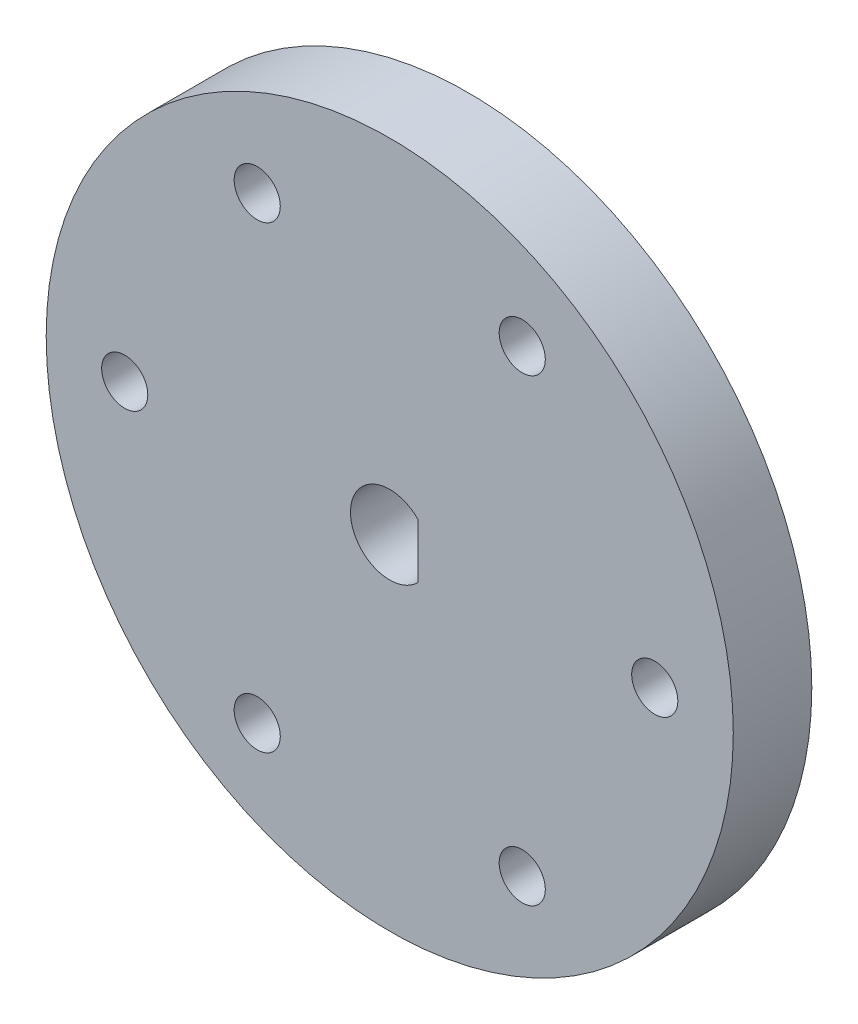
ISO-10303-21;
HEADER;
FILE_DESCRIPTION(('STEP AP214'),'2;1');
FILE_NAME('part.step','',(''),(''),'','','');
FILE_SCHEMA(('AUTOMOTIVE_DESIGN { 1 0 10303 214 1 1 1 1 }'));
ENDSEC;
DATA;
#1=APPLICATION_CONTEXT('core data for automotive mechanical design processes');
#2=APPLICATION_PROTOCOL_DEFINITION('international standard','automotive_design',2000,#1);
#3=PRODUCT_CONTEXT('',#1,'mechanical');
#4=PRODUCT('Part','Part','',(#3));
#5=PRODUCT_RELATED_PRODUCT_CATEGORY('part','',(#4));
#6=PRODUCT_DEFINITION_FORMATION('','',#4);
#7=PRODUCT_DEFINITION_CONTEXT('part definition',#1,'design');
#8=PRODUCT_DEFINITION('design','',#6,#7);
#9=PRODUCT_DEFINITION_SHAPE('','',#8);
#10=(LENGTH_UNIT() NAMED_UNIT(*) SI_UNIT(.MILLI.,.METRE.));
#11=(NAMED_UNIT(*) PLANE_ANGLE_UNIT() SI_UNIT($,.RADIAN.));
#12=(NAMED_UNIT(*) SI_UNIT($,.STERADIAN.) SOLID_ANGLE_UNIT());
#13=UNCERTAINTY_MEASURE_WITH_UNIT(LENGTH_MEASURE(1.E-05),#10,'distance_accuracy_value','');
#14=(GEOMETRIC_REPRESENTATION_CONTEXT(3) GLOBAL_UNCERTAINTY_ASSIGNED_CONTEXT((#13)) GLOBAL_UNIT_ASSIGNED_CONTEXT((#10,
#11,#12)) REPRESENTATION_CONTEXT('',''));
#15=CARTESIAN_POINT('',(0.,0.,0.));
#16=DIRECTION('',(0.,0.,1.));
#17=DIRECTION('',(1.,0.,0.));
#18=AXIS2_PLACEMENT_3D('',#15,#16,#17);
#19=CARTESIAN_POINT('',(0.,0.,8.));
#20=DIRECTION('',(0.,0.,1.));
#21=DIRECTION('',(1.,0.,0.));
#22=AXIS2_PLACEMENT_3D('',#19,#20,#21);
#23=PLANE('',#22);
#24=CARTESIAN_POINT('',(27.,0.,8.));
#25=DIRECTION('',(0.,0.,1.));
#26=DIRECTION('',(1.,0.,0.));
#27=AXIS2_PLACEMENT_3D('',#24,#25,#26);
#28=CIRCLE('',#27,2.35);
#29=CARTESIAN_POINT('',(29.35,0.,8.));
#30=VERTEX_POINT('',#29);
#31=EDGE_CURVE('E92',#30,#30,#28,.T.);
#32=ORIENTED_EDGE('',*,*,#31,.F.);
#33=EDGE_LOOP('',(#32));
#34=FACE_BOUND('',#33,.T.);
#35=CARTESIAN_POINT('',(13.5000000000003,23.3826859021797,8.));
#36=DIRECTION('',(0.,0.,1.));
#37=DIRECTION('',(1.,0.,0.));
#38=AXIS2_PLACEMENT_3D('',#35,#36,#37);
#39=CIRCLE('',#38,2.35);
#40=CARTESIAN_POINT('',(15.8500000000003,23.3826859021797,8.));
#41=VERTEX_POINT('',#40);
#42=EDGE_CURVE('E107',#41,#41,#39,.T.);
#43=ORIENTED_EDGE('',*,*,#42,.F.);
#44=EDGE_LOOP('',(#43));
#45=FACE_BOUND('',#44,.T.);
#46=CARTESIAN_POINT('',(-13.4999999999998,23.38268590218,8.));
#47=DIRECTION('',(0.,0.,1.));
#48=DIRECTION('',(1.,0.,0.));
#49=AXIS2_PLACEMENT_3D('',#46,#47,#48);
#50=CIRCLE('',#49,2.35);
#51=CARTESIAN_POINT('',(-11.1499999999998,23.38268590218,8.));
#52=VERTEX_POINT('',#51);
#53=EDGE_CURVE('E106',#52,#52,#50,.T.);
#54=ORIENTED_EDGE('',*,*,#53,.F.);
#55=EDGE_LOOP('',(#54));
#56=FACE_BOUND('',#55,.T.);
#57=CARTESIAN_POINT('',(-27.,1.88539992297529E-13,8.));
#58=DIRECTION('',(0.,0.,1.));
#59=DIRECTION('',(1.,0.,0.));
#60=AXIS2_PLACEMENT_3D('',#57,#58,#59);
#61=CIRCLE('',#60,2.35);
#62=CARTESIAN_POINT('',(-24.65,1.88539992297529E-13,8.));
#63=VERTEX_POINT('',#62);
#64=EDGE_CURVE('E115',#63,#63,#61,.T.);
#65=ORIENTED_EDGE('',*,*,#64,.F.);
#66=EDGE_LOOP('',(#65));
#67=FACE_BOUND('',#66,.T.);
#68=CARTESIAN_POINT('',(-13.5000000000001,-23.3826859021798,8.));
#69=DIRECTION('',(0.,0.,1.));
#70=DIRECTION('',(1.,0.,0.));
#71=AXIS2_PLACEMENT_3D('',#68,#69,#70);
#72=CIRCLE('',#71,2.35);
#73=CARTESIAN_POINT('',(-11.1500000000001,-23.3826859021798,8.));
#74=VERTEX_POINT('',#73);
#75=EDGE_CURVE('E123',#74,#74,#72,.T.);
#76=ORIENTED_EDGE('',*,*,#75,.F.);
#77=EDGE_LOOP('',(#76));
#78=FACE_BOUND('',#77,.T.);
#79=CARTESIAN_POINT('',(13.5,-23.3826859021799,8.));
#80=DIRECTION('',(0.,0.,1.));
#81=DIRECTION('',(1.,0.,0.));
#82=AXIS2_PLACEMENT_3D('',#79,#80,#81);
#83=CIRCLE('',#82,2.35);
#84=CARTESIAN_POINT('',(15.85,-23.3826859021799,8.));
#85=VERTEX_POINT('',#84);
#86=EDGE_CURVE('E131',#85,#85,#83,.T.);
#87=ORIENTED_EDGE('',*,*,#86,.F.);
#88=EDGE_LOOP('',(#87));
#89=FACE_BOUND('',#88,.T.);
#90=CARTESIAN_POINT('',(0.,0.,8.));
#91=DIRECTION('',(0.,0.,1.));
#92=DIRECTION('',(1.,0.,0.));
#93=AXIS2_PLACEMENT_3D('',#90,#91,#92);
#94=CIRCLE('',#93,35.);
#95=CARTESIAN_POINT('',(35.,0.,8.));
#96=VERTEX_POINT('',#95);
#97=EDGE_CURVE('E11',#96,#96,#94,.T.);
#98=ORIENTED_EDGE('',*,*,#97,.T.);
#99=EDGE_LOOP('',(#98));
#100=FACE_BOUND('',#99,.T.);
#101=DIRECTION('',(0.,1.,0.));
#102=VECTOR('',#101,1.);
#103=CARTESIAN_POINT('',(2.90473750965556,2.75,8.));
#104=LINE('',#103,#102);
#105=CARTESIAN_POINT('',(2.90473750965556,-2.75,8.));
#106=VERTEX_POINT('',#105);
#107=CARTESIAN_POINT('',(2.90473750965556,2.75,8.));
#108=VERTEX_POINT('',#107);
#109=EDGE_CURVE('E95',#106,#108,#104,.T.);
#110=ORIENTED_EDGE('',*,*,#109,.F.);
#111=CARTESIAN_POINT('',(0.,0.,8.));
#112=DIRECTION('',(0.,0.,1.));
#113=DIRECTION('',(1.,0.,0.));
#114=AXIS2_PLACEMENT_3D('',#111,#112,#113);
#115=CIRCLE('',#114,4.);
#116=EDGE_CURVE('E79',#108,#106,#115,.T.);
#117=ORIENTED_EDGE('',*,*,#116,.F.);
#118=EDGE_LOOP('',(#110,#117));
#119=FACE_BOUND('',#118,.T.);
#120=ADVANCED_FACE('F45',(#34,#45,#56,#67,#78,#89,#100,#119),#23,.T.);
#121=CARTESIAN_POINT('',(0.,0.,0.));
#122=DIRECTION('',(0.,0.,1.));
#123=DIRECTION('',(1.,0.,0.));
#124=AXIS2_PLACEMENT_3D('',#121,#122,#123);
#125=PLANE('',#124);
#126=CARTESIAN_POINT('',(0.,0.,0.));
#127=DIRECTION('',(0.,0.,1.));
#128=DIRECTION('',(1.,0.,0.));
#129=AXIS2_PLACEMENT_3D('',#126,#127,#128);
#130=CIRCLE('',#129,35.);
#131=CARTESIAN_POINT('',(35.,0.,0.));
#132=VERTEX_POINT('',#131);
#133=EDGE_CURVE('E49',#132,#132,#130,.T.);
#134=ORIENTED_EDGE('',*,*,#133,.F.);
#135=EDGE_LOOP('',(#134));
#136=FACE_BOUND('',#135,.T.);
#137=CARTESIAN_POINT('',(0.,0.,0.));
#138=DIRECTION('',(0.,0.,1.));
#139=DIRECTION('',(1.,0.,0.));
#140=AXIS2_PLACEMENT_3D('',#137,#138,#139);
#141=CIRCLE('',#140,4.);
#142=CARTESIAN_POINT('',(2.90473750965556,2.75,0.));
#143=VERTEX_POINT('',#142);
#144=CARTESIAN_POINT('',(2.90473750965556,-2.75,0.));
#145=VERTEX_POINT('',#144);
#146=EDGE_CURVE('E68',#143,#145,#141,.T.);
#147=ORIENTED_EDGE('',*,*,#146,.T.);
#148=DIRECTION('',(0.,1.,0.));
#149=VECTOR('',#148,1.);
#150=CARTESIAN_POINT('',(2.90473750965556,2.75,0.));
#151=LINE('',#150,#149);
#152=EDGE_CURVE('E74',#145,#143,#151,.T.);
#153=ORIENTED_EDGE('',*,*,#152,.T.);
#154=EDGE_LOOP('',(#147,#153));
#155=FACE_BOUND('',#154,.T.);
#156=ADVANCED_FACE('F86',(#136,#155),#125,.F.);
#157=CARTESIAN_POINT('',(0.,0.,8.));
#158=DIRECTION('',(0.,0.,-1.));
#159=DIRECTION('',(-1.,0.,0.));
#160=AXIS2_PLACEMENT_3D('',#157,#158,#159);
#161=CYLINDRICAL_SURFACE('',#160,35.);
#162=ORIENTED_EDGE('',*,*,#97,.F.);
#163=EDGE_LOOP('',(#162));
#164=FACE_BOUND('',#163,.T.);
#165=ORIENTED_EDGE('',*,*,#133,.T.);
#166=EDGE_LOOP('',(#165));
#167=FACE_BOUND('',#166,.T.);
#168=ADVANCED_FACE('F47',(#164,#167),#161,.T.);
#169=CARTESIAN_POINT('',(0.,0.,8.));
#170=DIRECTION('',(0.,0.,-1.));
#171=DIRECTION('',(-1.,0.,0.));
#172=AXIS2_PLACEMENT_3D('',#169,#170,#171);
#173=CYLINDRICAL_SURFACE('',#172,4.);
#174=ORIENTED_EDGE('',*,*,#146,.F.);
#175=DIRECTION('',(0.,0.,-1.));
#176=VECTOR('',#175,1.);
#177=CARTESIAN_POINT('',(2.90473750965556,2.75,8.));
#178=LINE('',#177,#176);
#179=EDGE_CURVE('E76',#108,#143,#178,.T.);
#180=ORIENTED_EDGE('',*,*,#179,.F.);
#181=ORIENTED_EDGE('',*,*,#116,.T.);
#182=DIRECTION('',(0.,0.,-1.));
#183=VECTOR('',#182,1.);
#184=CARTESIAN_POINT('',(2.90473750965556,-2.75,8.));
#185=LINE('',#184,#183);
#186=EDGE_CURVE('E61',#106,#145,#185,.T.);
#187=ORIENTED_EDGE('',*,*,#186,.T.);
#188=EDGE_LOOP('',(#174,#180,#181,#187));
#189=FACE_BOUND('',#188,.T.);
#190=ADVANCED_FACE('F81',(#189),#173,.F.);
#191=CARTESIAN_POINT('',(2.90473750965556,2.75,8.));
#192=DIRECTION('',(-1.,0.,0.));
#193=DIRECTION('',(0.,0.,1.));
#194=AXIS2_PLACEMENT_3D('',#191,#192,#193);
#195=PLANE('',#194);
#196=ORIENTED_EDGE('',*,*,#152,.F.);
#197=ORIENTED_EDGE('',*,*,#186,.F.);
#198=ORIENTED_EDGE('',*,*,#109,.T.);
#199=ORIENTED_EDGE('',*,*,#179,.T.);
#200=EDGE_LOOP('',(#196,#197,#198,#199));
#201=FACE_BOUND('',#200,.T.);
#202=ADVANCED_FACE('F75',(#201),#195,.T.);
#203=CARTESIAN_POINT('',(13.5,-23.3826859021799,3.));
#204=DIRECTION('',(0.,0.,1.));
#205=DIRECTION('',(1.,0.,0.));
#206=AXIS2_PLACEMENT_3D('',#203,#204,#205);
#207=CYLINDRICAL_SURFACE('',#206,2.35);
#208=CARTESIAN_POINT('',(13.5,-23.3826859021799,3.));
#209=DIRECTION('',(0.,0.,1.));
#210=DIRECTION('',(1.,0.,0.));
#211=AXIS2_PLACEMENT_3D('',#208,#209,#210);
#212=CIRCLE('',#211,2.35);
#213=CARTESIAN_POINT('',(15.85,-23.3826859021799,3.));
#214=VERTEX_POINT('',#213);
#215=EDGE_CURVE('E127',#214,#214,#212,.T.);
#216=ORIENTED_EDGE('',*,*,#215,.F.);
#217=EDGE_LOOP('',(#216));
#218=FACE_BOUND('',#217,.T.);
#219=ORIENTED_EDGE('',*,*,#86,.T.);
#220=EDGE_LOOP('',(#219));
#221=FACE_BOUND('',#220,.T.);
#222=ADVANCED_FACE('F178',(#218,#221),#207,.F.);
#223=CARTESIAN_POINT('',(13.5,-23.3826859021799,3.));
#224=DIRECTION('',(0.,0.,1.));
#225=DIRECTION('',(1.,0.,0.));
#226=AXIS2_PLACEMENT_3D('',#223,#224,#225);
#227=PLANE('',#226);
#228=ORIENTED_EDGE('',*,*,#215,.T.);
#229=EDGE_LOOP('',(#228));
#230=FACE_BOUND('',#229,.T.);
#231=ADVANCED_FACE('F203',(#230),#227,.T.);
#232=CARTESIAN_POINT('',(-13.5000000000001,-23.3826859021798,3.));
#233=DIRECTION('',(0.,0.,1.));
#234=DIRECTION('',(1.,0.,0.));
#235=AXIS2_PLACEMENT_3D('',#232,#233,#234);
#236=CYLINDRICAL_SURFACE('',#235,2.35);
#237=CARTESIAN_POINT('',(-13.5000000000001,-23.3826859021798,3.));
#238=DIRECTION('',(0.,0.,1.));
#239=DIRECTION('',(1.,0.,0.));
#240=AXIS2_PLACEMENT_3D('',#237,#238,#239);
#241=CIRCLE('',#240,2.35);
#242=CARTESIAN_POINT('',(-11.1500000000001,-23.3826859021798,3.));
#243=VERTEX_POINT('',#242);
#244=EDGE_CURVE('E119',#243,#243,#241,.T.);
#245=ORIENTED_EDGE('',*,*,#244,.F.);
#246=EDGE_LOOP('',(#245));
#247=FACE_BOUND('',#246,.T.);
#248=ORIENTED_EDGE('',*,*,#75,.T.);
#249=EDGE_LOOP('',(#248));
#250=FACE_BOUND('',#249,.T.);
#251=ADVANCED_FACE('F199',(#247,#250),#236,.F.);
#252=CARTESIAN_POINT('',(-13.5000000000001,-23.3826859021798,3.));
#253=DIRECTION('',(0.,0.,1.));
#254=DIRECTION('',(1.,0.,0.));
#255=AXIS2_PLACEMENT_3D('',#252,#253,#254);
#256=PLANE('',#255);
#257=ORIENTED_EDGE('',*,*,#244,.T.);
#258=EDGE_LOOP('',(#257));
#259=FACE_BOUND('',#258,.T.);
#260=ADVANCED_FACE('F195',(#259),#256,.T.);
#261=CARTESIAN_POINT('',(-27.,1.88539992297529E-13,3.));
#262=DIRECTION('',(0.,0.,1.));
#263=DIRECTION('',(1.,0.,0.));
#264=AXIS2_PLACEMENT_3D('',#261,#262,#263);
#265=CYLINDRICAL_SURFACE('',#264,2.35);
#266=CARTESIAN_POINT('',(-27.,1.88539992297529E-13,3.));
#267=DIRECTION('',(0.,0.,1.));
#268=DIRECTION('',(1.,0.,0.));
#269=AXIS2_PLACEMENT_3D('',#266,#267,#268);
#270=CIRCLE('',#269,2.35);
#271=CARTESIAN_POINT('',(-24.65,1.88539992297529E-13,3.));
#272=VERTEX_POINT('',#271);
#273=EDGE_CURVE('E111',#272,#272,#270,.T.);
#274=ORIENTED_EDGE('',*,*,#273,.F.);
#275=EDGE_LOOP('',(#274));
#276=FACE_BOUND('',#275,.T.);
#277=ORIENTED_EDGE('',*,*,#64,.T.);
#278=EDGE_LOOP('',(#277));
#279=FACE_BOUND('',#278,.T.);
#280=ADVANCED_FACE('F191',(#276,#279),#265,.F.);
#281=CARTESIAN_POINT('',(-27.,1.88539992297529E-13,3.));
#282=DIRECTION('',(0.,0.,1.));
#283=DIRECTION('',(1.,0.,0.));
#284=AXIS2_PLACEMENT_3D('',#281,#282,#283);
#285=PLANE('',#284);
#286=ORIENTED_EDGE('',*,*,#273,.T.);
#287=EDGE_LOOP('',(#286));
#288=FACE_BOUND('',#287,.T.);
#289=ADVANCED_FACE('F187',(#288),#285,.T.);
#290=CARTESIAN_POINT('',(-13.4999999999998,23.38268590218,3.));
#291=DIRECTION('',(0.,0.,1.));
#292=DIRECTION('',(1.,0.,0.));
#293=AXIS2_PLACEMENT_3D('',#290,#291,#292);
#294=CYLINDRICAL_SURFACE('',#293,2.35);
#295=CARTESIAN_POINT('',(-13.4999999999998,23.38268590218,3.));
#296=DIRECTION('',(0.,0.,1.));
#297=DIRECTION('',(1.,0.,0.));
#298=AXIS2_PLACEMENT_3D('',#295,#296,#297);
#299=CIRCLE('',#298,2.35);
#300=CARTESIAN_POINT('',(-11.1499999999998,23.38268590218,3.));
#301=VERTEX_POINT('',#300);
#302=EDGE_CURVE('E102',#301,#301,#299,.T.);
#303=ORIENTED_EDGE('',*,*,#302,.F.);
#304=EDGE_LOOP('',(#303));
#305=FACE_BOUND('',#304,.T.);
#306=ORIENTED_EDGE('',*,*,#53,.T.);
#307=EDGE_LOOP('',(#306));
#308=FACE_BOUND('',#307,.T.);
#309=ADVANCED_FACE('F183',(#305,#308),#294,.F.);
#310=CARTESIAN_POINT('',(-13.4999999999998,23.38268590218,3.));
#311=DIRECTION('',(0.,0.,1.));
#312=DIRECTION('',(1.,0.,0.));
#313=AXIS2_PLACEMENT_3D('',#310,#311,#312);
#314=PLANE('',#313);
#315=ORIENTED_EDGE('',*,*,#302,.T.);
#316=EDGE_LOOP('',(#315));
#317=FACE_BOUND('',#316,.T.);
#318=ADVANCED_FACE('F179',(#317),#314,.T.);
#319=CARTESIAN_POINT('',(13.5000000000003,23.3826859021797,3.));
#320=DIRECTION('',(0.,0.,1.));
#321=DIRECTION('',(1.,0.,0.));
#322=AXIS2_PLACEMENT_3D('',#319,#320,#321);
#323=CYLINDRICAL_SURFACE('',#322,2.35);
#324=CARTESIAN_POINT('',(13.5000000000003,23.3826859021797,3.));
#325=DIRECTION('',(0.,0.,1.));
#326=DIRECTION('',(1.,0.,0.));
#327=AXIS2_PLACEMENT_3D('',#324,#325,#326);
#328=CIRCLE('',#327,2.35);
#329=CARTESIAN_POINT('',(15.8500000000003,23.3826859021797,3.));
#330=VERTEX_POINT('',#329);
#331=EDGE_CURVE('E135',#330,#330,#328,.T.);
#332=ORIENTED_EDGE('',*,*,#331,.F.);
#333=EDGE_LOOP('',(#332));
#334=FACE_BOUND('',#333,.T.);
#335=ORIENTED_EDGE('',*,*,#42,.T.);
#336=EDGE_LOOP('',(#335));
#337=FACE_BOUND('',#336,.T.);
#338=ADVANCED_FACE('F182',(#334,#337),#323,.F.);
#339=CARTESIAN_POINT('',(13.5000000000003,23.3826859021797,3.));
#340=DIRECTION('',(0.,0.,1.));
#341=DIRECTION('',(1.,0.,0.));
#342=AXIS2_PLACEMENT_3D('',#339,#340,#341);
#343=PLANE('',#342);
#344=ORIENTED_EDGE('',*,*,#331,.T.);
#345=EDGE_LOOP('',(#344));
#346=FACE_BOUND('',#345,.T.);
#347=ADVANCED_FACE('F211',(#346),#343,.T.);
#348=CARTESIAN_POINT('',(27.,0.,3.));
#349=DIRECTION('',(0.,0.,1.));
#350=DIRECTION('',(1.,0.,0.));
#351=AXIS2_PLACEMENT_3D('',#348,#349,#350);
#352=CYLINDRICAL_SURFACE('',#351,2.35);
#353=CARTESIAN_POINT('',(27.,0.,3.));
#354=DIRECTION('',(0.,0.,1.));
#355=DIRECTION('',(1.,0.,0.));
#356=AXIS2_PLACEMENT_3D('',#353,#354,#355);
#357=CIRCLE('',#356,2.35);
#358=CARTESIAN_POINT('',(29.35,0.,3.));
#359=VERTEX_POINT('',#358);
#360=EDGE_CURVE('E88',#359,#359,#357,.T.);
#361=ORIENTED_EDGE('',*,*,#360,.F.);
#362=EDGE_LOOP('',(#361));
#363=FACE_BOUND('',#362,.T.);
#364=ORIENTED_EDGE('',*,*,#31,.T.);
#365=EDGE_LOOP('',(#364));
#366=FACE_BOUND('',#365,.T.);
#367=ADVANCED_FACE('F146',(#363,#366),#352,.F.);
#368=CARTESIAN_POINT('',(27.,0.,3.));
#369=DIRECTION('',(0.,0.,1.));
#370=DIRECTION('',(1.,0.,0.));
#371=AXIS2_PLACEMENT_3D('',#368,#369,#370);
#372=PLANE('',#371);
#373=ORIENTED_EDGE('',*,*,#360,.T.);
#374=EDGE_LOOP('',(#373));
#375=FACE_BOUND('',#374,.T.);
#376=ADVANCED_FACE('F220',(#375),#372,.T.);
#377=CLOSED_SHELL('',(#120,#156,#168,#190,#202,#222,#231,#251,#260,#280,#289,#309,#318,#338,
#347,#367,#376));
#378=MANIFOLD_SOLID_BREP('B2',#377);
#379=ADVANCED_BREP_SHAPE_REPRESENTATION('',(#18,#378),#14);
#380=SHAPE_DEFINITION_REPRESENTATION(#9,#379);
ENDSEC;
END-ISO-10303-21;
